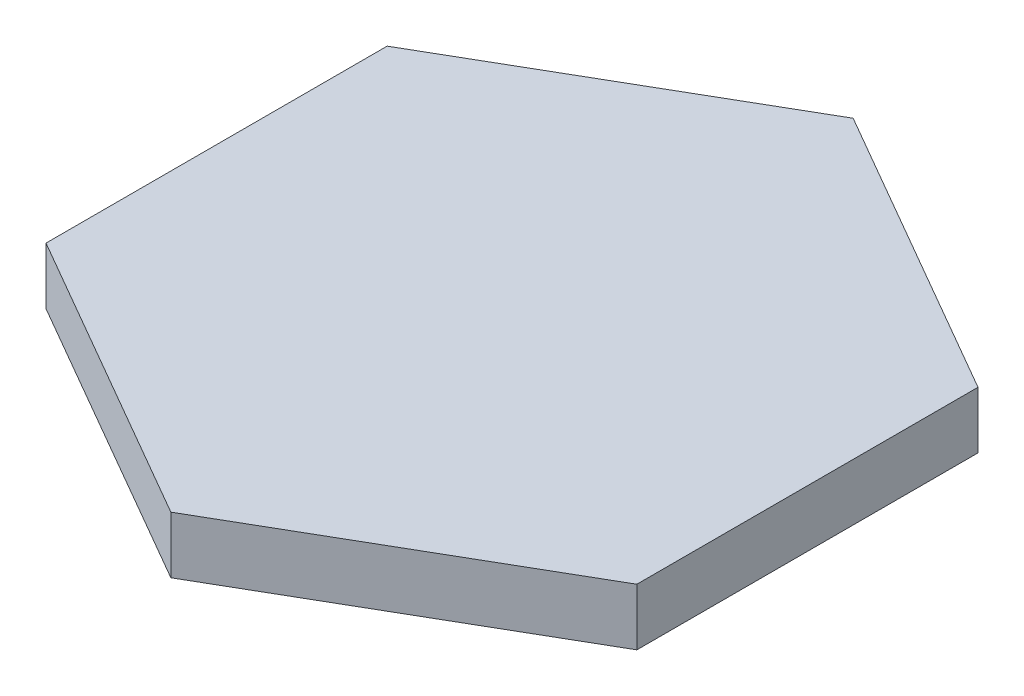
ISO-10303-21;
HEADER;
FILE_DESCRIPTION(('STEP AP214'),'2;1');
FILE_NAME('part.step','',(''),(''),'','','');
FILE_SCHEMA(('AUTOMOTIVE_DESIGN { 1 0 10303 214 1 1 1 1 }'));
ENDSEC;
DATA;
#1=APPLICATION_CONTEXT('core data for automotive mechanical design processes');
#2=APPLICATION_PROTOCOL_DEFINITION('international standard','automotive_design',2000,#1);
#3=PRODUCT_CONTEXT('',#1,'mechanical');
#4=PRODUCT('Part','Part','',(#3));
#5=PRODUCT_RELATED_PRODUCT_CATEGORY('part','',(#4));
#6=PRODUCT_DEFINITION_FORMATION('','',#4);
#7=PRODUCT_DEFINITION_CONTEXT('part definition',#1,'design');
#8=PRODUCT_DEFINITION('design','',#6,#7);
#9=PRODUCT_DEFINITION_SHAPE('','',#8);
#10=(LENGTH_UNIT() NAMED_UNIT(*) SI_UNIT(.MILLI.,.METRE.));
#11=(NAMED_UNIT(*) PLANE_ANGLE_UNIT() SI_UNIT($,.RADIAN.));
#12=(NAMED_UNIT(*) SI_UNIT($,.STERADIAN.) SOLID_ANGLE_UNIT());
#13=UNCERTAINTY_MEASURE_WITH_UNIT(LENGTH_MEASURE(1.E-05),#10,'distance_accuracy_value','');
#14=(GEOMETRIC_REPRESENTATION_CONTEXT(3) GLOBAL_UNCERTAINTY_ASSIGNED_CONTEXT((#13)) GLOBAL_UNIT_ASSIGNED_CONTEXT((#10,
#11,#12)) REPRESENTATION_CONTEXT('',''));
#15=CARTESIAN_POINT('',(0.,0.,0.));
#16=DIRECTION('',(0.,0.,1.));
#17=DIRECTION('',(1.,0.,0.));
#18=AXIS2_PLACEMENT_3D('',#15,#16,#17);
#19=CARTESIAN_POINT('',(32.9955678841895,-6.35,19.0499999999959));
#20=DIRECTION('',(1.,0.,-1.24390145311513E-13));
#21=DIRECTION('',(-1.24390145311513E-13,0.,-1.));
#22=AXIS2_PLACEMENT_3D('',#19,#20,#21);
#23=PLANE('',#22);
#24=DIRECTION('',(-1.24390145311513E-13,0.,-1.));
#25=VECTOR('',#24,1.);
#26=CARTESIAN_POINT('',(32.9955678841895,0.,19.0499999999959));
#27=LINE('',#26,#25);
#28=CARTESIAN_POINT('',(32.9955678841895,0.,19.0499999999959));
#29=VERTEX_POINT('',#28);
#30=CARTESIAN_POINT('',(32.9955678841847,0.,-19.0500000000041));
#31=VERTEX_POINT('',#30);
#32=EDGE_CURVE('E124',#29,#31,#27,.T.);
#33=ORIENTED_EDGE('',*,*,#32,.F.);
#34=DIRECTION('',(0.,1.,0.));
#35=VECTOR('',#34,1.);
#36=CARTESIAN_POINT('',(32.9955678841895,-6.35,19.0499999999959));
#37=LINE('',#36,#35);
#38=CARTESIAN_POINT('',(32.9955678841895,-6.35,19.0499999999959));
#39=VERTEX_POINT('',#38);
#40=EDGE_CURVE('E11',#39,#29,#37,.T.);
#41=ORIENTED_EDGE('',*,*,#40,.F.);
#42=DIRECTION('',(-1.24390145311513E-13,0.,-1.));
#43=VECTOR('',#42,1.);
#44=CARTESIAN_POINT('',(32.9955678841895,-6.35,19.0499999999959));
#45=LINE('',#44,#43);
#46=CARTESIAN_POINT('',(32.9955678841847,-6.35,-19.0500000000041));
#47=VERTEX_POINT('',#46);
#48=EDGE_CURVE('E138',#39,#47,#45,.T.);
#49=ORIENTED_EDGE('',*,*,#48,.T.);
#50=DIRECTION('',(0.,1.,0.));
#51=VECTOR('',#50,1.);
#52=CARTESIAN_POINT('',(32.9955678841847,-6.35,-19.0500000000041));
#53=LINE('',#52,#51);
#54=EDGE_CURVE('E42',#47,#31,#53,.T.);
#55=ORIENTED_EDGE('',*,*,#54,.T.);
#56=EDGE_LOOP('',(#33,#41,#49,#55));
#57=FACE_BOUND('',#56,.T.);
#58=ADVANCED_FACE('F39',(#57),#23,.T.);
#59=CARTESIAN_POINT('',(4.71175062754726E-12,-6.35,38.1));
#60=DIRECTION('',(0.500000000000107,0.,0.866025403784377));
#61=DIRECTION('',(0.866025403784377,0.,-0.500000000000107));
#62=AXIS2_PLACEMENT_3D('',#59,#60,#61);
#63=PLANE('',#62);
#64=DIRECTION('',(0.866025403784377,0.,-0.500000000000107));
#65=VECTOR('',#64,1.);
#66=CARTESIAN_POINT('',(4.71175062754726E-12,0.,38.1));
#67=LINE('',#66,#65);
#68=CARTESIAN_POINT('',(4.71175062754726E-12,0.,38.1));
#69=VERTEX_POINT('',#68);
#70=EDGE_CURVE('E136',#69,#29,#67,.T.);
#71=ORIENTED_EDGE('',*,*,#70,.F.);
#72=DIRECTION('',(0.,1.,0.));
#73=VECTOR('',#72,1.);
#74=CARTESIAN_POINT('',(4.71175062754726E-12,-6.35,38.1));
#75=LINE('',#74,#73);
#76=CARTESIAN_POINT('',(4.71175062754726E-12,-6.35,38.1));
#77=VERTEX_POINT('',#76);
#78=EDGE_CURVE('E48',#77,#69,#75,.T.);
#79=ORIENTED_EDGE('',*,*,#78,.F.);
#80=DIRECTION('',(0.866025403784377,0.,-0.500000000000107));
#81=VECTOR('',#80,1.);
#82=CARTESIAN_POINT('',(4.71175062754726E-12,-6.35,38.1));
#83=LINE('',#82,#81);
#84=EDGE_CURVE('E114',#77,#39,#83,.T.);
#85=ORIENTED_EDGE('',*,*,#84,.T.);
#86=ORIENTED_EDGE('',*,*,#40,.T.);
#87=EDGE_LOOP('',(#71,#79,#85,#86));
#88=FACE_BOUND('',#87,.T.);
#89=ADVANCED_FACE('F146',(#88),#63,.T.);
#90=CARTESIAN_POINT('',(-32.9955678841848,-6.35,19.0500000000041));
#91=DIRECTION('',(-0.499999999999893,0.,0.866025403784501));
#92=DIRECTION('',(0.866025403784501,0.,0.499999999999893));
#93=AXIS2_PLACEMENT_3D('',#90,#91,#92);
#94=PLANE('',#93);
#95=DIRECTION('',(0.866025403784501,0.,0.499999999999893));
#96=VECTOR('',#95,1.);
#97=CARTESIAN_POINT('',(-32.9955678841848,0.,19.0500000000041));
#98=LINE('',#97,#96);
#99=CARTESIAN_POINT('',(-32.9955678841848,0.,19.0500000000041));
#100=VERTEX_POINT('',#99);
#101=EDGE_CURVE('E101',#100,#69,#98,.T.);
#102=ORIENTED_EDGE('',*,*,#101,.F.);
#103=DIRECTION('',(0.,1.,0.));
#104=VECTOR('',#103,1.);
#105=CARTESIAN_POINT('',(-32.9955678841848,-6.35,19.0500000000041));
#106=LINE('',#105,#104);
#107=CARTESIAN_POINT('',(-32.9955678841848,-6.35,19.0500000000041));
#108=VERTEX_POINT('',#107);
#109=EDGE_CURVE('E96',#108,#100,#106,.T.);
#110=ORIENTED_EDGE('',*,*,#109,.F.);
#111=DIRECTION('',(0.866025403784501,0.,0.499999999999893));
#112=VECTOR('',#111,1.);
#113=CARTESIAN_POINT('',(-32.9955678841848,-6.35,19.0500000000041));
#114=LINE('',#113,#112);
#115=EDGE_CURVE('E99',#108,#77,#114,.T.);
#116=ORIENTED_EDGE('',*,*,#115,.T.);
#117=ORIENTED_EDGE('',*,*,#78,.T.);
#118=EDGE_LOOP('',(#102,#110,#116,#117));
#119=FACE_BOUND('',#118,.T.);
#120=ADVANCED_FACE('F98',(#119),#94,.T.);
#121=CARTESIAN_POINT('',(-32.9955678841895,-6.35,-19.0499999999959));
#122=DIRECTION('',(-1.,0.,1.2384377571278E-13));
#123=DIRECTION('',(1.2384377571278E-13,0.,1.));
#124=AXIS2_PLACEMENT_3D('',#121,#122,#123);
#125=PLANE('',#124);
#126=DIRECTION('',(1.2384377571278E-13,0.,1.));
#127=VECTOR('',#126,1.);
#128=CARTESIAN_POINT('',(-32.9955678841895,0.,-19.0499999999959));
#129=LINE('',#128,#127);
#130=CARTESIAN_POINT('',(-32.9955678841895,0.,-19.0499999999959));
#131=VERTEX_POINT('',#130);
#132=EDGE_CURVE('E133',#131,#100,#129,.T.);
#133=ORIENTED_EDGE('',*,*,#132,.F.);
#134=DIRECTION('',(0.,1.,0.));
#135=VECTOR('',#134,1.);
#136=CARTESIAN_POINT('',(-32.9955678841895,-6.35,-19.0499999999959));
#137=LINE('',#136,#135);
#138=CARTESIAN_POINT('',(-32.9955678841895,-6.35,-19.0499999999959));
#139=VERTEX_POINT('',#138);
#140=EDGE_CURVE('E106',#139,#131,#137,.T.);
#141=ORIENTED_EDGE('',*,*,#140,.F.);
#142=DIRECTION('',(1.2384377571278E-13,0.,1.));
#143=VECTOR('',#142,1.);
#144=CARTESIAN_POINT('',(-32.9955678841895,-6.35,-19.0499999999959));
#145=LINE('',#144,#143);
#146=EDGE_CURVE('E112',#139,#108,#145,.T.);
#147=ORIENTED_EDGE('',*,*,#146,.T.);
#148=ORIENTED_EDGE('',*,*,#109,.T.);
#149=EDGE_LOOP('',(#133,#141,#147,#148));
#150=FACE_BOUND('',#149,.T.);
#151=ADVANCED_FACE('F116',(#150),#125,.T.);
#152=CARTESIAN_POINT('',(-4.73358316208388E-12,-6.35,-38.1));
#153=DIRECTION('',(-0.500000000000107,0.,-0.866025403784377));
#154=DIRECTION('',(-0.866025403784377,0.,0.500000000000107));
#155=AXIS2_PLACEMENT_3D('',#152,#153,#154);
#156=PLANE('',#155);
#157=DIRECTION('',(-0.866025403784377,0.,0.500000000000107));
#158=VECTOR('',#157,1.);
#159=CARTESIAN_POINT('',(-4.73358316208388E-12,0.,-38.1));
#160=LINE('',#159,#158);
#161=CARTESIAN_POINT('',(-4.73358316208388E-12,0.,-38.1));
#162=VERTEX_POINT('',#161);
#163=EDGE_CURVE('E130',#162,#131,#160,.T.);
#164=ORIENTED_EDGE('',*,*,#163,.F.);
#165=DIRECTION('',(0.,1.,0.));
#166=VECTOR('',#165,1.);
#167=CARTESIAN_POINT('',(-4.73358316208388E-12,-6.35,-38.1));
#168=LINE('',#167,#166);
#169=CARTESIAN_POINT('',(-4.73358316208388E-12,-6.35,-38.1));
#170=VERTEX_POINT('',#169);
#171=EDGE_CURVE('E141',#170,#162,#168,.T.);
#172=ORIENTED_EDGE('',*,*,#171,.F.);
#173=DIRECTION('',(-0.866025403784377,0.,0.500000000000107));
#174=VECTOR('',#173,1.);
#175=CARTESIAN_POINT('',(-4.73358316208388E-12,-6.35,-38.1));
#176=LINE('',#175,#174);
#177=EDGE_CURVE('E117',#170,#139,#176,.T.);
#178=ORIENTED_EDGE('',*,*,#177,.T.);
#179=ORIENTED_EDGE('',*,*,#140,.T.);
#180=EDGE_LOOP('',(#164,#172,#178,#179));
#181=FACE_BOUND('',#180,.T.);
#182=ADVANCED_FACE('F159',(#181),#156,.T.);
#183=CARTESIAN_POINT('',(32.9955678841847,-6.35,-19.0500000000041));
#184=DIRECTION('',(0.499999999999893,0.,-0.866025403784501));
#185=DIRECTION('',(-0.866025403784501,0.,-0.499999999999893));
#186=AXIS2_PLACEMENT_3D('',#183,#184,#185);
#187=PLANE('',#186);
#188=DIRECTION('',(-0.866025403784501,0.,-0.499999999999893));
#189=VECTOR('',#188,1.);
#190=CARTESIAN_POINT('',(32.9955678841847,0.,-19.0500000000041));
#191=LINE('',#190,#189);
#192=EDGE_CURVE('E127',#31,#162,#191,.T.);
#193=ORIENTED_EDGE('',*,*,#192,.F.);
#194=ORIENTED_EDGE('',*,*,#54,.F.);
#195=DIRECTION('',(-0.866025403784501,0.,-0.499999999999893));
#196=VECTOR('',#195,1.);
#197=CARTESIAN_POINT('',(32.9955678841847,-6.35,-19.0500000000041));
#198=LINE('',#197,#196);
#199=EDGE_CURVE('E119',#47,#170,#198,.T.);
#200=ORIENTED_EDGE('',*,*,#199,.T.);
#201=ORIENTED_EDGE('',*,*,#171,.T.);
#202=EDGE_LOOP('',(#193,#194,#200,#201));
#203=FACE_BOUND('',#202,.T.);
#204=ADVANCED_FACE('F143',(#203),#187,.T.);
#205=CARTESIAN_POINT('',(0.,-6.35,0.));
#206=DIRECTION('',(0.,1.,0.));
#207=DIRECTION('',(0.,0.,1.));
#208=AXIS2_PLACEMENT_3D('',#205,#206,#207);
#209=PLANE('',#208);
#210=ORIENTED_EDGE('',*,*,#48,.F.);
#211=ORIENTED_EDGE('',*,*,#84,.F.);
#212=ORIENTED_EDGE('',*,*,#115,.F.);
#213=ORIENTED_EDGE('',*,*,#146,.F.);
#214=ORIENTED_EDGE('',*,*,#177,.F.);
#215=ORIENTED_EDGE('',*,*,#199,.F.);
#216=EDGE_LOOP('',(#210,#211,#212,#213,#214,#215));
#217=FACE_BOUND('',#216,.T.);
#218=ADVANCED_FACE('F110',(#217),#209,.F.);
#219=CARTESIAN_POINT('',(0.,0.,0.));
#220=DIRECTION('',(0.,1.,0.));
#221=DIRECTION('',(0.,0.,1.));
#222=AXIS2_PLACEMENT_3D('',#219,#220,#221);
#223=PLANE('',#222);
#224=ORIENTED_EDGE('',*,*,#32,.T.);
#225=ORIENTED_EDGE('',*,*,#192,.T.);
#226=ORIENTED_EDGE('',*,*,#163,.T.);
#227=ORIENTED_EDGE('',*,*,#132,.T.);
#228=ORIENTED_EDGE('',*,*,#101,.T.);
#229=ORIENTED_EDGE('',*,*,#70,.T.);
#230=EDGE_LOOP('',(#224,#225,#226,#227,#228,#229));
#231=FACE_BOUND('',#230,.T.);
#232=ADVANCED_FACE('F145',(#231),#223,.T.);
#233=CLOSED_SHELL('',(#58,#89,#120,#151,#182,#204,#218,#232));
#234=MANIFOLD_SOLID_BREP('B2',#233);
#235=ADVANCED_BREP_SHAPE_REPRESENTATION('',(#18,#234),#14);
#236=SHAPE_DEFINITION_REPRESENTATION(#9,#235);
ENDSEC;
END-ISO-10303-21;
